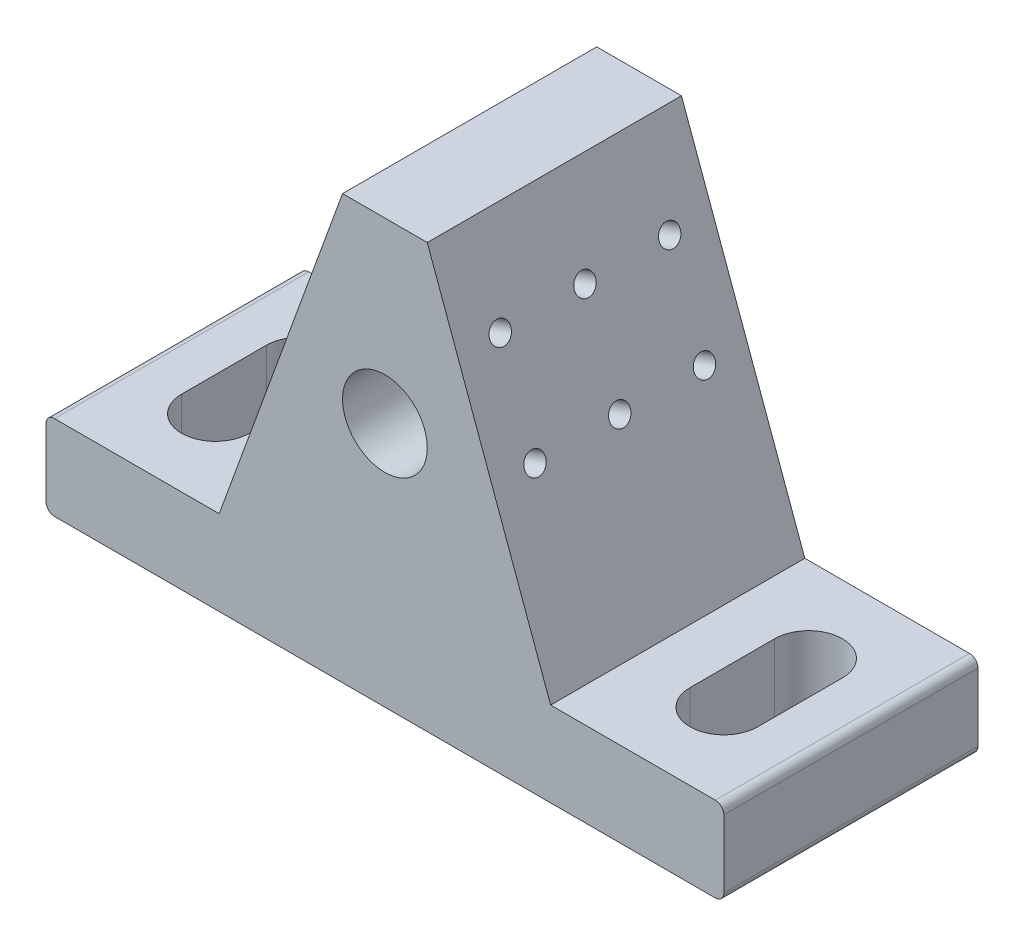
ISO-10303-21;
HEADER;
FILE_DESCRIPTION(('STEP AP214'),'2;1');
FILE_NAME('part.step','',(''),(''),'','','');
FILE_SCHEMA(('AUTOMOTIVE_DESIGN { 1 0 10303 214 1 1 1 1 }'));
ENDSEC;
DATA;
#1=APPLICATION_CONTEXT('core data for automotive mechanical design processes');
#2=APPLICATION_PROTOCOL_DEFINITION('international standard','automotive_design',2000,#1);
#3=PRODUCT_CONTEXT('',#1,'mechanical');
#4=PRODUCT('Part','Part','',(#3));
#5=PRODUCT_RELATED_PRODUCT_CATEGORY('part','',(#4));
#6=PRODUCT_DEFINITION_FORMATION('','',#4);
#7=PRODUCT_DEFINITION_CONTEXT('part definition',#1,'design');
#8=PRODUCT_DEFINITION('design','',#6,#7);
#9=PRODUCT_DEFINITION_SHAPE('','',#8);
#10=(LENGTH_UNIT() NAMED_UNIT(*) SI_UNIT(.MILLI.,.METRE.));
#11=(NAMED_UNIT(*) PLANE_ANGLE_UNIT() SI_UNIT($,.RADIAN.));
#12=(NAMED_UNIT(*) SI_UNIT($,.STERADIAN.) SOLID_ANGLE_UNIT());
#13=UNCERTAINTY_MEASURE_WITH_UNIT(LENGTH_MEASURE(1.E-05),#10,'distance_accuracy_value','');
#14=(GEOMETRIC_REPRESENTATION_CONTEXT(3) GLOBAL_UNCERTAINTY_ASSIGNED_CONTEXT((#13)) GLOBAL_UNIT_ASSIGNED_CONTEXT((#10,
#11,#12)) REPRESENTATION_CONTEXT('',''));
#15=CARTESIAN_POINT('',(0.,0.,0.));
#16=DIRECTION('',(0.,0.,1.));
#17=DIRECTION('',(1.,0.,0.));
#18=AXIS2_PLACEMENT_3D('',#15,#16,#17);
#19=CARTESIAN_POINT('',(19.558809370648,10.,15.));
#20=DIRECTION('',(-0.939692620785909,-0.342020143325666,0.));
#21=DIRECTION('',(0.342020143325666,-0.939692620785909,0.));
#22=AXIS2_PLACEMENT_3D('',#19,#20,#21);
#23=PLANE('',#22);
#24=CARTESIAN_POINT('',(8.61416478422666,40.0701638651491,-10.));
#25=DIRECTION('',(0.939692620785909,0.342020143325666,0.));
#26=DIRECTION('',(-0.342020143325666,0.939692620785909,0.));
#27=AXIS2_PLACEMENT_3D('',#24,#25,#26);
#28=CIRCLE('',#27,1.24999999999999);
#29=CARTESIAN_POINT('',(8.18663960506958,41.2447796411315,-10.));
#30=VERTEX_POINT('',#29);
#31=EDGE_CURVE('E230',#30,#30,#28,.T.);
#32=ORIENTED_EDGE('',*,*,#31,.F.);
#33=EDGE_LOOP('',(#32));
#34=FACE_BOUND('',#33,.T.);
#35=CARTESIAN_POINT('',(12.7184065041347,28.7938524157182,-10.));
#36=DIRECTION('',(0.939692620785909,0.342020143325666,0.));
#37=DIRECTION('',(-0.342020143325666,0.939692620785909,0.));
#38=AXIS2_PLACEMENT_3D('',#35,#36,#37);
#39=CIRCLE('',#38,1.24999999999999);
#40=CARTESIAN_POINT('',(12.2908813249776,29.9684681917006,-10.));
#41=VERTEX_POINT('',#40);
#42=EDGE_CURVE('E229',#41,#41,#39,.T.);
#43=ORIENTED_EDGE('',*,*,#42,.F.);
#44=EDGE_LOOP('',(#43));
#45=FACE_BOUND('',#44,.T.);
#46=CARTESIAN_POINT('',(8.61416478422666,40.0701638651491,0.));
#47=DIRECTION('',(0.939692620785909,0.342020143325666,0.));
#48=DIRECTION('',(-0.342020143325666,0.939692620785909,0.));
#49=AXIS2_PLACEMENT_3D('',#46,#47,#48);
#50=CIRCLE('',#49,1.24999999999999);
#51=CARTESIAN_POINT('',(8.18663960506958,41.2447796411315,0.));
#52=VERTEX_POINT('',#51);
#53=EDGE_CURVE('E245',#52,#52,#50,.T.);
#54=ORIENTED_EDGE('',*,*,#53,.F.);
#55=EDGE_LOOP('',(#54));
#56=FACE_BOUND('',#55,.T.);
#57=CARTESIAN_POINT('',(12.7184065041347,28.7938524157182,0.));
#58=DIRECTION('',(0.939692620785909,0.342020143325666,0.));
#59=DIRECTION('',(-0.342020143325666,0.939692620785909,0.));
#60=AXIS2_PLACEMENT_3D('',#57,#58,#59);
#61=CIRCLE('',#60,1.24999999999999);
#62=CARTESIAN_POINT('',(12.2908813249776,29.9684681917006,0.));
#63=VERTEX_POINT('',#62);
#64=EDGE_CURVE('E253',#63,#63,#61,.T.);
#65=ORIENTED_EDGE('',*,*,#64,.F.);
#66=EDGE_LOOP('',(#65));
#67=FACE_BOUND('',#66,.T.);
#68=CARTESIAN_POINT('',(8.61416478422666,40.0701638651491,10.));
#69=DIRECTION('',(0.939692620785909,0.342020143325666,0.));
#70=DIRECTION('',(-0.342020143325666,0.939692620785909,0.));
#71=AXIS2_PLACEMENT_3D('',#68,#69,#70);
#72=CIRCLE('',#71,1.24999999999999);
#73=CARTESIAN_POINT('',(8.18663960506958,41.2447796411315,10.));
#74=VERTEX_POINT('',#73);
#75=EDGE_CURVE('E261',#74,#74,#72,.T.);
#76=ORIENTED_EDGE('',*,*,#75,.F.);
#77=EDGE_LOOP('',(#76));
#78=FACE_BOUND('',#77,.T.);
#79=DIRECTION('',(-0.342020143325666,0.939692620785909,0.));
#80=VECTOR('',#79,1.);
#81=CARTESIAN_POINT('',(19.558809370648,10.,-15.));
#82=LINE('',#81,#80);
#83=CARTESIAN_POINT('',(19.558809370648,10.,-15.));
#84=VERTEX_POINT('',#83);
#85=CARTESIAN_POINT('',(5.,50.,-15.));
#86=VERTEX_POINT('',#85);
#87=EDGE_CURVE('E390',#84,#86,#82,.T.);
#88=ORIENTED_EDGE('',*,*,#87,.T.);
#89=DIRECTION('',(0.,0.,-1.));
#90=VECTOR('',#89,1.);
#91=CARTESIAN_POINT('',(5.,50.,15.));
#92=LINE('',#91,#90);
#93=CARTESIAN_POINT('',(5.,50.,15.));
#94=VERTEX_POINT('',#93);
#95=EDGE_CURVE('E416',#94,#86,#92,.T.);
#96=ORIENTED_EDGE('',*,*,#95,.F.);
#97=DIRECTION('',(-0.342020143325666,0.939692620785909,0.));
#98=VECTOR('',#97,1.);
#99=CARTESIAN_POINT('',(19.558809370648,10.,15.));
#100=LINE('',#99,#98);
#101=CARTESIAN_POINT('',(19.558809370648,10.,15.));
#102=VERTEX_POINT('',#101);
#103=EDGE_CURVE('E363',#102,#94,#100,.T.);
#104=ORIENTED_EDGE('',*,*,#103,.F.);
#105=DIRECTION('',(0.,0.,-1.));
#106=VECTOR('',#105,1.);
#107=CARTESIAN_POINT('',(19.558809370648,10.,15.));
#108=LINE('',#107,#106);
#109=EDGE_CURVE('E420',#102,#84,#108,.T.);
#110=ORIENTED_EDGE('',*,*,#109,.T.);
#111=EDGE_LOOP('',(#88,#96,#104,#110));
#112=FACE_BOUND('',#111,.T.);
#113=CARTESIAN_POINT('',(12.7184065041347,28.7938524157182,10.));
#114=DIRECTION('',(0.939692620785909,0.342020143325666,0.));
#115=DIRECTION('',(-0.342020143325666,0.939692620785909,0.));
#116=AXIS2_PLACEMENT_3D('',#113,#114,#115);
#117=CIRCLE('',#116,1.24999999999999);
#118=CARTESIAN_POINT('',(12.2908813249776,29.9684681917006,10.));
#119=VERTEX_POINT('',#118);
#120=EDGE_CURVE('E269',#119,#119,#117,.T.);
#121=ORIENTED_EDGE('',*,*,#120,.F.);
#122=EDGE_LOOP('',(#121));
#123=FACE_BOUND('',#122,.T.);
#124=ADVANCED_FACE('F62',(#34,#45,#56,#67,#78,#112,#123),#23,.F.);
#125=CARTESIAN_POINT('',(40.,10.,15.));
#126=DIRECTION('',(0.,-1.,0.));
#127=DIRECTION('',(1.,0.,0.));
#128=AXIS2_PLACEMENT_3D('',#125,#126,#127);
#129=PLANE('',#128);
#130=DIRECTION('',(-1.,0.,0.));
#131=VECTOR('',#130,1.);
#132=CARTESIAN_POINT('',(40.,10.,15.));
#133=LINE('',#132,#131);
#134=CARTESIAN_POINT('',(39.,10.,15.));
#135=VERTEX_POINT('',#134);
#136=EDGE_CURVE('E359',#135,#102,#133,.T.);
#137=ORIENTED_EDGE('',*,*,#136,.F.);
#138=DIRECTION('',(0.,0.,-1.));
#139=VECTOR('',#138,1.);
#140=CARTESIAN_POINT('',(39.,10.,15.));
#141=LINE('',#140,#139);
#142=CARTESIAN_POINT('',(39.,10.,-15.));
#143=VERTEX_POINT('',#142);
#144=EDGE_CURVE('E14',#135,#143,#141,.T.);
#145=ORIENTED_EDGE('',*,*,#144,.T.);
#146=DIRECTION('',(-1.,0.,0.));
#147=VECTOR('',#146,1.);
#148=CARTESIAN_POINT('',(40.,10.,-15.));
#149=LINE('',#148,#147);
#150=EDGE_CURVE('E387',#143,#84,#149,.T.);
#151=ORIENTED_EDGE('',*,*,#150,.T.);
#152=ORIENTED_EDGE('',*,*,#109,.F.);
#153=EDGE_LOOP('',(#137,#145,#151,#152));
#154=FACE_BOUND('',#153,.T.);
#155=CARTESIAN_POINT('',(30.,10.,5.));
#156=DIRECTION('',(0.,-1.,0.));
#157=DIRECTION('',(1.,0.,0.));
#158=AXIS2_PLACEMENT_3D('',#155,#156,#157);
#159=CIRCLE('',#158,4.);
#160=CARTESIAN_POINT('',(26.,9.99999999999999,5.));
#161=VERTEX_POINT('',#160);
#162=CARTESIAN_POINT('',(34.,10.,5.));
#163=VERTEX_POINT('',#162);
#164=EDGE_CURVE('E352',#161,#163,#159,.F.);
#165=ORIENTED_EDGE('',*,*,#164,.F.);
#166=DIRECTION('',(0.,0.,1.));
#167=VECTOR('',#166,1.);
#168=CARTESIAN_POINT('',(26.,10.,15.));
#169=LINE('',#168,#167);
#170=CARTESIAN_POINT('',(26.,10.,-5.));
#171=VERTEX_POINT('',#170);
#172=EDGE_CURVE('E342',#171,#161,#169,.T.);
#173=ORIENTED_EDGE('',*,*,#172,.F.);
#174=CARTESIAN_POINT('',(30.,10.,-5.));
#175=DIRECTION('',(0.,-1.,0.));
#176=DIRECTION('',(1.,0.,0.));
#177=AXIS2_PLACEMENT_3D('',#174,#175,#176);
#178=CIRCLE('',#177,4.);
#179=CARTESIAN_POINT('',(34.,10.,-5.));
#180=VERTEX_POINT('',#179);
#181=EDGE_CURVE('E345',#180,#171,#178,.F.);
#182=ORIENTED_EDGE('',*,*,#181,.F.);
#183=DIRECTION('',(0.,0.,-1.));
#184=VECTOR('',#183,1.);
#185=CARTESIAN_POINT('',(34.,10.,15.));
#186=LINE('',#185,#184);
#187=EDGE_CURVE('E349',#163,#180,#186,.T.);
#188=ORIENTED_EDGE('',*,*,#187,.F.);
#189=EDGE_LOOP('',(#165,#173,#182,#188));
#190=FACE_BOUND('',#189,.T.);
#191=ADVANCED_FACE('F646',(#154,#190),#129,.F.);
#192=CARTESIAN_POINT('',(-40.,0.,15.));
#193=DIRECTION('',(0.,1.,0.));
#194=DIRECTION('',(0.,0.,1.));
#195=AXIS2_PLACEMENT_3D('',#192,#193,#194);
#196=PLANE('',#195);
#197=DIRECTION('',(0.,0.,-1.));
#198=VECTOR('',#197,1.);
#199=CARTESIAN_POINT('',(-34.,0.,5.));
#200=LINE('',#199,#198);
#201=CARTESIAN_POINT('',(-34.,0.,5.));
#202=VERTEX_POINT('',#201);
#203=CARTESIAN_POINT('',(-34.,0.,-5.));
#204=VERTEX_POINT('',#203);
#205=EDGE_CURVE('E296',#202,#204,#200,.T.);
#206=ORIENTED_EDGE('',*,*,#205,.F.);
#207=CARTESIAN_POINT('',(-30.,0.,5.));
#208=DIRECTION('',(0.,-1.,0.));
#209=DIRECTION('',(0.,0.,1.));
#210=AXIS2_PLACEMENT_3D('',#207,#208,#209);
#211=CIRCLE('',#210,4.);
#212=CARTESIAN_POINT('',(-26.,0.,5.));
#213=VERTEX_POINT('',#212);
#214=EDGE_CURVE('E282',#213,#202,#211,.T.);
#215=ORIENTED_EDGE('',*,*,#214,.F.);
#216=DIRECTION('',(0.,0.,1.));
#217=VECTOR('',#216,1.);
#218=CARTESIAN_POINT('',(-26.,0.,5.));
#219=LINE('',#218,#217);
#220=CARTESIAN_POINT('',(-26.,0.,-5.));
#221=VERTEX_POINT('',#220);
#222=EDGE_CURVE('E288',#221,#213,#219,.T.);
#223=ORIENTED_EDGE('',*,*,#222,.F.);
#224=CARTESIAN_POINT('',(-30.,0.,-5.));
#225=DIRECTION('',(0.,-1.,0.));
#226=DIRECTION('',(0.,0.,1.));
#227=AXIS2_PLACEMENT_3D('',#224,#225,#226);
#228=CIRCLE('',#227,4.);
#229=EDGE_CURVE('E292',#204,#221,#228,.T.);
#230=ORIENTED_EDGE('',*,*,#229,.F.);
#231=EDGE_LOOP('',(#206,#215,#223,#230));
#232=FACE_BOUND('',#231,.T.);
#233=DIRECTION('',(1.,0.,0.));
#234=VECTOR('',#233,1.);
#235=CARTESIAN_POINT('',(-40.,0.,15.));
#236=LINE('',#235,#234);
#237=CARTESIAN_POINT('',(-39.,0.,15.));
#238=VERTEX_POINT('',#237);
#239=CARTESIAN_POINT('',(39.,0.,15.));
#240=VERTEX_POINT('',#239);
#241=EDGE_CURVE('E379',#238,#240,#236,.T.);
#242=ORIENTED_EDGE('',*,*,#241,.F.);
#243=DIRECTION('',(0.,0.,-1.));
#244=VECTOR('',#243,1.);
#245=CARTESIAN_POINT('',(-39.,0.,15.));
#246=LINE('',#245,#244);
#247=CARTESIAN_POINT('',(-39.,0.,-15.));
#248=VERTEX_POINT('',#247);
#249=EDGE_CURVE('E443',#238,#248,#246,.T.);
#250=ORIENTED_EDGE('',*,*,#249,.T.);
#251=DIRECTION('',(1.,0.,0.));
#252=VECTOR('',#251,1.);
#253=CARTESIAN_POINT('',(-40.,0.,-15.));
#254=LINE('',#253,#252);
#255=CARTESIAN_POINT('',(39.,0.,-15.));
#256=VERTEX_POINT('',#255);
#257=EDGE_CURVE('E360',#248,#256,#254,.T.);
#258=ORIENTED_EDGE('',*,*,#257,.T.);
#259=DIRECTION('',(0.,0.,-1.));
#260=VECTOR('',#259,1.);
#261=CARTESIAN_POINT('',(39.,0.,15.));
#262=LINE('',#261,#260);
#263=EDGE_CURVE('E440',#256,#240,#262,.F.);
#264=ORIENTED_EDGE('',*,*,#263,.T.);
#265=EDGE_LOOP('',(#242,#250,#258,#264));
#266=FACE_BOUND('',#265,.T.);
#267=CARTESIAN_POINT('',(30.,0.,5.));
#268=DIRECTION('',(0.,1.,0.));
#269=DIRECTION('',(0.,0.,1.));
#270=AXIS2_PLACEMENT_3D('',#267,#268,#269);
#271=CIRCLE('',#270,4.);
#272=CARTESIAN_POINT('',(26.,0.,5.));
#273=VERTEX_POINT('',#272);
#274=CARTESIAN_POINT('',(34.,0.,5.));
#275=VERTEX_POINT('',#274);
#276=EDGE_CURVE('E313',#273,#275,#271,.T.);
#277=ORIENTED_EDGE('',*,*,#276,.T.);
#278=DIRECTION('',(0.,0.,-1.));
#279=VECTOR('',#278,1.);
#280=CARTESIAN_POINT('',(34.,0.,5.));
#281=LINE('',#280,#279);
#282=CARTESIAN_POINT('',(34.,0.,-5.));
#283=VERTEX_POINT('',#282);
#284=EDGE_CURVE('E317',#275,#283,#281,.T.);
#285=ORIENTED_EDGE('',*,*,#284,.T.);
#286=CARTESIAN_POINT('',(30.,0.,-5.));
#287=DIRECTION('',(0.,1.,0.));
#288=DIRECTION('',(0.,0.,1.));
#289=AXIS2_PLACEMENT_3D('',#286,#287,#288);
#290=CIRCLE('',#289,4.);
#291=CARTESIAN_POINT('',(26.,0.,-5.));
#292=VERTEX_POINT('',#291);
#293=EDGE_CURVE('E321',#283,#292,#290,.T.);
#294=ORIENTED_EDGE('',*,*,#293,.T.);
#295=DIRECTION('',(0.,0.,1.));
#296=VECTOR('',#295,1.);
#297=CARTESIAN_POINT('',(26.,0.,5.));
#298=LINE('',#297,#296);
#299=EDGE_CURVE('E325',#292,#273,#298,.T.);
#300=ORIENTED_EDGE('',*,*,#299,.T.);
#301=EDGE_LOOP('',(#277,#285,#294,#300));
#302=FACE_BOUND('',#301,.T.);
#303=ADVANCED_FACE('F680',(#232,#266,#302),#196,.F.);
#304=CARTESIAN_POINT('',(40.,0.,15.));
#305=DIRECTION('',(-1.,0.,0.));
#306=DIRECTION('',(0.,0.,1.));
#307=AXIS2_PLACEMENT_3D('',#304,#305,#306);
#308=PLANE('',#307);
#309=DIRECTION('',(0.,1.,0.));
#310=VECTOR('',#309,1.);
#311=CARTESIAN_POINT('',(40.,0.,15.));
#312=LINE('',#311,#310);
#313=CARTESIAN_POINT('',(40.,1.,15.));
#314=VERTEX_POINT('',#313);
#315=CARTESIAN_POINT('',(40.,9.,15.));
#316=VERTEX_POINT('',#315);
#317=EDGE_CURVE('E356',#314,#316,#312,.T.);
#318=ORIENTED_EDGE('',*,*,#317,.F.);
#319=DIRECTION('',(0.,0.,-1.));
#320=VECTOR('',#319,1.);
#321=CARTESIAN_POINT('',(40.,1.,15.));
#322=LINE('',#321,#320);
#323=CARTESIAN_POINT('',(40.,1.,-15.));
#324=VERTEX_POINT('',#323);
#325=EDGE_CURVE('E480',#314,#324,#322,.T.);
#326=ORIENTED_EDGE('',*,*,#325,.T.);
#327=DIRECTION('',(0.,1.,0.));
#328=VECTOR('',#327,1.);
#329=CARTESIAN_POINT('',(40.,0.,-15.));
#330=LINE('',#329,#328);
#331=CARTESIAN_POINT('',(40.,9.,-15.));
#332=VERTEX_POINT('',#331);
#333=EDGE_CURVE('E355',#324,#332,#330,.T.);
#334=ORIENTED_EDGE('',*,*,#333,.T.);
#335=DIRECTION('',(0.,0.,-1.));
#336=VECTOR('',#335,1.);
#337=CARTESIAN_POINT('',(40.,9.,15.));
#338=LINE('',#337,#336);
#339=EDGE_CURVE('E477',#332,#316,#338,.F.);
#340=ORIENTED_EDGE('',*,*,#339,.T.);
#341=EDGE_LOOP('',(#318,#326,#334,#340));
#342=FACE_BOUND('',#341,.T.);
#343=ADVANCED_FACE('F634',(#342),#308,.F.);
#344=CARTESIAN_POINT('',(5.,50.,15.));
#345=DIRECTION('',(0.,-1.,0.));
#346=DIRECTION('',(0.,0.,-1.));
#347=AXIS2_PLACEMENT_3D('',#344,#345,#346);
#348=PLANE('',#347);
#349=DIRECTION('',(-1.,0.,0.));
#350=VECTOR('',#349,1.);
#351=CARTESIAN_POINT('',(5.,50.,-15.));
#352=LINE('',#351,#350);
#353=CARTESIAN_POINT('',(-5.,50.,-15.));
#354=VERTEX_POINT('',#353);
#355=EDGE_CURVE('E393',#86,#354,#352,.T.);
#356=ORIENTED_EDGE('',*,*,#355,.T.);
#357=DIRECTION('',(0.,0.,-1.));
#358=VECTOR('',#357,1.);
#359=CARTESIAN_POINT('',(-5.,50.,15.));
#360=LINE('',#359,#358);
#361=CARTESIAN_POINT('',(-5.,50.,15.));
#362=VERTEX_POINT('',#361);
#363=EDGE_CURVE('E412',#362,#354,#360,.T.);
#364=ORIENTED_EDGE('',*,*,#363,.F.);
#365=DIRECTION('',(-1.,0.,0.));
#366=VECTOR('',#365,1.);
#367=CARTESIAN_POINT('',(5.,50.,15.));
#368=LINE('',#367,#366);
#369=EDGE_CURVE('E366',#94,#362,#368,.T.);
#370=ORIENTED_EDGE('',*,*,#369,.F.);
#371=ORIENTED_EDGE('',*,*,#95,.T.);
#372=EDGE_LOOP('',(#356,#364,#370,#371));
#373=FACE_BOUND('',#372,.T.);
#374=ADVANCED_FACE('F658',(#373),#348,.F.);
#375=CARTESIAN_POINT('',(-19.558809370648,10.,15.));
#376=DIRECTION('',(0.939692620785909,-0.342020143325666,0.));
#377=DIRECTION('',(0.342020143325666,0.939692620785909,0.));
#378=AXIS2_PLACEMENT_3D('',#375,#376,#377);
#379=PLANE('',#378);
#380=DIRECTION('',(-0.342020143325666,-0.939692620785909,0.));
#381=VECTOR('',#380,1.);
#382=CARTESIAN_POINT('',(-19.558809370648,10.,-15.));
#383=LINE('',#382,#381);
#384=CARTESIAN_POINT('',(-19.558809370648,10.,-15.));
#385=VERTEX_POINT('',#384);
#386=EDGE_CURVE('E396',#354,#385,#383,.T.);
#387=ORIENTED_EDGE('',*,*,#386,.T.);
#388=DIRECTION('',(0.,0.,-1.));
#389=VECTOR('',#388,1.);
#390=CARTESIAN_POINT('',(-19.558809370648,10.,15.));
#391=LINE('',#390,#389);
#392=CARTESIAN_POINT('',(-19.558809370648,10.,15.));
#393=VERTEX_POINT('',#392);
#394=EDGE_CURVE('E383',#393,#385,#391,.T.);
#395=ORIENTED_EDGE('',*,*,#394,.F.);
#396=DIRECTION('',(-0.342020143325666,-0.939692620785909,0.));
#397=VECTOR('',#396,1.);
#398=CARTESIAN_POINT('',(-19.558809370648,10.,15.));
#399=LINE('',#398,#397);
#400=EDGE_CURVE('E369',#362,#393,#399,.T.);
#401=ORIENTED_EDGE('',*,*,#400,.F.);
#402=ORIENTED_EDGE('',*,*,#363,.T.);
#403=EDGE_LOOP('',(#387,#395,#401,#402));
#404=FACE_BOUND('',#403,.T.);
#405=ADVANCED_FACE('F663',(#404),#379,.F.);
#406=CARTESIAN_POINT('',(-40.,10.,15.));
#407=DIRECTION('',(0.,-1.,0.));
#408=DIRECTION('',(1.,0.,0.));
#409=AXIS2_PLACEMENT_3D('',#406,#407,#408);
#410=PLANE('',#409);
#411=DIRECTION('',(0.,0.,1.));
#412=VECTOR('',#411,1.);
#413=CARTESIAN_POINT('',(-26.,10.,15.));
#414=LINE('',#413,#412);
#415=CARTESIAN_POINT('',(-26.,10.,-5.));
#416=VERTEX_POINT('',#415);
#417=CARTESIAN_POINT('',(-26.,9.99999999999999,5.));
#418=VERTEX_POINT('',#417);
#419=EDGE_CURVE('E432',#416,#418,#414,.T.);
#420=ORIENTED_EDGE('',*,*,#419,.T.);
#421=CARTESIAN_POINT('',(-30.,10.,5.));
#422=DIRECTION('',(0.,-1.,0.));
#423=DIRECTION('',(1.,0.,0.));
#424=AXIS2_PLACEMENT_3D('',#421,#422,#423);
#425=CIRCLE('',#424,4.);
#426=CARTESIAN_POINT('',(-34.,10.,5.));
#427=VERTEX_POINT('',#426);
#428=EDGE_CURVE('E436',#418,#427,#425,.T.);
#429=ORIENTED_EDGE('',*,*,#428,.T.);
#430=DIRECTION('',(0.,0.,-1.));
#431=VECTOR('',#430,1.);
#432=CARTESIAN_POINT('',(-34.,10.,15.));
#433=LINE('',#432,#431);
#434=CARTESIAN_POINT('',(-34.,10.,-5.));
#435=VERTEX_POINT('',#434);
#436=EDGE_CURVE('E424',#427,#435,#433,.T.);
#437=ORIENTED_EDGE('',*,*,#436,.T.);
#438=CARTESIAN_POINT('',(-30.,10.,-5.));
#439=DIRECTION('',(0.,-1.,0.));
#440=DIRECTION('',(1.,0.,0.));
#441=AXIS2_PLACEMENT_3D('',#438,#439,#440);
#442=CIRCLE('',#441,4.);
#443=EDGE_CURVE('E428',#435,#416,#442,.T.);
#444=ORIENTED_EDGE('',*,*,#443,.T.);
#445=EDGE_LOOP('',(#420,#429,#437,#444));
#446=FACE_BOUND('',#445,.T.);
#447=DIRECTION('',(-1.,0.,0.));
#448=VECTOR('',#447,1.);
#449=CARTESIAN_POINT('',(-40.,10.,-15.));
#450=LINE('',#449,#448);
#451=CARTESIAN_POINT('',(-39.,10.,-15.));
#452=VERTEX_POINT('',#451);
#453=EDGE_CURVE('E399',#385,#452,#450,.T.);
#454=ORIENTED_EDGE('',*,*,#453,.T.);
#455=DIRECTION('',(0.,0.,-1.));
#456=VECTOR('',#455,1.);
#457=CARTESIAN_POINT('',(-39.,10.,15.));
#458=LINE('',#457,#456);
#459=CARTESIAN_POINT('',(-39.,10.,15.));
#460=VERTEX_POINT('',#459);
#461=EDGE_CURVE('E71',#452,#460,#458,.F.);
#462=ORIENTED_EDGE('',*,*,#461,.T.);
#463=DIRECTION('',(-1.,0.,0.));
#464=VECTOR('',#463,1.);
#465=CARTESIAN_POINT('',(-40.,10.,15.));
#466=LINE('',#465,#464);
#467=EDGE_CURVE('E372',#393,#460,#466,.T.);
#468=ORIENTED_EDGE('',*,*,#467,.F.);
#469=ORIENTED_EDGE('',*,*,#394,.T.);
#470=EDGE_LOOP('',(#454,#462,#468,#469));
#471=FACE_BOUND('',#470,.T.);
#472=ADVANCED_FACE('F718',(#446,#471),#410,.F.);
#473=CARTESIAN_POINT('',(-40.,0.,15.));
#474=DIRECTION('',(1.,0.,0.));
#475=DIRECTION('',(0.,0.,-1.));
#476=AXIS2_PLACEMENT_3D('',#473,#474,#475);
#477=PLANE('',#476);
#478=DIRECTION('',(0.,-1.,0.));
#479=VECTOR('',#478,1.);
#480=CARTESIAN_POINT('',(-40.,0.,-15.));
#481=LINE('',#480,#479);
#482=CARTESIAN_POINT('',(-40.,9.,-15.));
#483=VERTEX_POINT('',#482);
#484=CARTESIAN_POINT('',(-40.,1.,-15.));
#485=VERTEX_POINT('',#484);
#486=EDGE_CURVE('E402',#483,#485,#481,.T.);
#487=ORIENTED_EDGE('',*,*,#486,.T.);
#488=DIRECTION('',(0.,0.,-1.));
#489=VECTOR('',#488,1.);
#490=CARTESIAN_POINT('',(-40.,1.,15.));
#491=LINE('',#490,#489);
#492=CARTESIAN_POINT('',(-40.,1.,15.));
#493=VERTEX_POINT('',#492);
#494=EDGE_CURVE('E463',#485,#493,#491,.F.);
#495=ORIENTED_EDGE('',*,*,#494,.T.);
#496=DIRECTION('',(0.,-1.,0.));
#497=VECTOR('',#496,1.);
#498=CARTESIAN_POINT('',(-40.,0.,15.));
#499=LINE('',#498,#497);
#500=CARTESIAN_POINT('',(-40.,9.,15.));
#501=VERTEX_POINT('',#500);
#502=EDGE_CURVE('E375',#501,#493,#499,.T.);
#503=ORIENTED_EDGE('',*,*,#502,.F.);
#504=DIRECTION('',(0.,0.,-1.));
#505=VECTOR('',#504,1.);
#506=CARTESIAN_POINT('',(-40.,9.,15.));
#507=LINE('',#506,#505);
#508=EDGE_CURVE('E459',#501,#483,#507,.T.);
#509=ORIENTED_EDGE('',*,*,#508,.T.);
#510=EDGE_LOOP('',(#487,#495,#503,#509));
#511=FACE_BOUND('',#510,.T.);
#512=ADVANCED_FACE('F671',(#511),#477,.F.);
#513=CARTESIAN_POINT('',(0.,0.,15.));
#514=DIRECTION('',(0.,0.,1.));
#515=DIRECTION('',(1.,0.,0.));
#516=AXIS2_PLACEMENT_3D('',#513,#514,#515);
#517=PLANE('',#516);
#518=CARTESIAN_POINT('',(0.,29.,15.));
#519=DIRECTION('',(0.,0.,1.));
#520=DIRECTION('',(1.,0.,0.));
#521=AXIS2_PLACEMENT_3D('',#518,#519,#520);
#522=CIRCLE('',#521,5.);
#523=CARTESIAN_POINT('',(5.,29.,15.));
#524=VERTEX_POINT('',#523);
#525=EDGE_CURVE('E277',#524,#524,#522,.T.);
#526=ORIENTED_EDGE('',*,*,#525,.F.);
#527=EDGE_LOOP('',(#526));
#528=FACE_BOUND('',#527,.T.);
#529=ORIENTED_EDGE('',*,*,#502,.T.);
#530=CARTESIAN_POINT('',(-39.,1.,15.));
#531=DIRECTION('',(0.,0.,1.));
#532=DIRECTION('',(1.,0.,0.));
#533=AXIS2_PLACEMENT_3D('',#530,#531,#532);
#534=CIRCLE('',#533,1.);
#535=EDGE_CURVE('E474',#493,#238,#534,.T.);
#536=ORIENTED_EDGE('',*,*,#535,.T.);
#537=ORIENTED_EDGE('',*,*,#241,.T.);
#538=CARTESIAN_POINT('',(39.,1.,15.));
#539=DIRECTION('',(0.,0.,1.));
#540=DIRECTION('',(1.,0.,0.));
#541=AXIS2_PLACEMENT_3D('',#538,#539,#540);
#542=CIRCLE('',#541,1.);
#543=EDGE_CURVE('E471',#240,#314,#542,.T.);
#544=ORIENTED_EDGE('',*,*,#543,.T.);
#545=ORIENTED_EDGE('',*,*,#317,.T.);
#546=CARTESIAN_POINT('',(39.,9.,15.));
#547=DIRECTION('',(0.,0.,1.));
#548=DIRECTION('',(1.,0.,0.));
#549=AXIS2_PLACEMENT_3D('',#546,#547,#548);
#550=CIRCLE('',#549,1.);
#551=EDGE_CURVE('E85',#316,#135,#550,.T.);
#552=ORIENTED_EDGE('',*,*,#551,.T.);
#553=ORIENTED_EDGE('',*,*,#136,.T.);
#554=ORIENTED_EDGE('',*,*,#103,.T.);
#555=ORIENTED_EDGE('',*,*,#369,.T.);
#556=ORIENTED_EDGE('',*,*,#400,.T.);
#557=ORIENTED_EDGE('',*,*,#467,.T.);
#558=CARTESIAN_POINT('',(-39.,9.,15.));
#559=DIRECTION('',(0.,0.,1.));
#560=DIRECTION('',(1.,0.,0.));
#561=AXIS2_PLACEMENT_3D('',#558,#559,#560);
#562=CIRCLE('',#561,1.);
#563=EDGE_CURVE('E468',#460,#501,#562,.T.);
#564=ORIENTED_EDGE('',*,*,#563,.T.);
#565=EDGE_LOOP('',(#529,#536,#537,#544,#545,#552,#553,#554,#555,#556,#557,#564));
#566=FACE_BOUND('',#565,.T.);
#567=ADVANCED_FACE('F650',(#528,#566),#517,.T.);
#568=CARTESIAN_POINT('',(0.,0.,-15.));
#569=DIRECTION('',(0.,0.,1.));
#570=DIRECTION('',(1.,0.,0.));
#571=AXIS2_PLACEMENT_3D('',#568,#569,#570);
#572=PLANE('',#571);
#573=CARTESIAN_POINT('',(0.,29.,-15.));
#574=DIRECTION('',(0.,0.,1.));
#575=DIRECTION('',(1.,0.,0.));
#576=AXIS2_PLACEMENT_3D('',#573,#574,#575);
#577=CIRCLE('',#576,5.);
#578=CARTESIAN_POINT('',(5.,29.,-15.));
#579=VERTEX_POINT('',#578);
#580=EDGE_CURVE('E278',#579,#579,#577,.T.);
#581=ORIENTED_EDGE('',*,*,#580,.T.);
#582=EDGE_LOOP('',(#581));
#583=FACE_BOUND('',#582,.T.);
#584=ORIENTED_EDGE('',*,*,#257,.F.);
#585=CARTESIAN_POINT('',(-39.,1.,-15.));
#586=DIRECTION('',(0.,0.,1.));
#587=DIRECTION('',(1.,0.,0.));
#588=AXIS2_PLACEMENT_3D('',#585,#586,#587);
#589=CIRCLE('',#588,1.);
#590=EDGE_CURVE('E456',#248,#485,#589,.F.);
#591=ORIENTED_EDGE('',*,*,#590,.T.);
#592=ORIENTED_EDGE('',*,*,#486,.F.);
#593=CARTESIAN_POINT('',(-39.,9.,-15.));
#594=DIRECTION('',(0.,0.,1.));
#595=DIRECTION('',(1.,0.,0.));
#596=AXIS2_PLACEMENT_3D('',#593,#594,#595);
#597=CIRCLE('',#596,1.);
#598=EDGE_CURVE('E450',#483,#452,#597,.F.);
#599=ORIENTED_EDGE('',*,*,#598,.T.);
#600=ORIENTED_EDGE('',*,*,#453,.F.);
#601=ORIENTED_EDGE('',*,*,#386,.F.);
#602=ORIENTED_EDGE('',*,*,#355,.F.);
#603=ORIENTED_EDGE('',*,*,#87,.F.);
#604=ORIENTED_EDGE('',*,*,#150,.F.);
#605=CARTESIAN_POINT('',(39.,9.,-15.));
#606=DIRECTION('',(0.,0.,1.));
#607=DIRECTION('',(1.,0.,0.));
#608=AXIS2_PLACEMENT_3D('',#605,#606,#607);
#609=CIRCLE('',#608,1.);
#610=EDGE_CURVE('E447',#143,#332,#609,.F.);
#611=ORIENTED_EDGE('',*,*,#610,.T.);
#612=ORIENTED_EDGE('',*,*,#333,.F.);
#613=CARTESIAN_POINT('',(39.,1.,-15.));
#614=DIRECTION('',(0.,0.,1.));
#615=DIRECTION('',(1.,0.,0.));
#616=AXIS2_PLACEMENT_3D('',#613,#614,#615);
#617=CIRCLE('',#616,1.);
#618=EDGE_CURVE('E453',#324,#256,#617,.F.);
#619=ORIENTED_EDGE('',*,*,#618,.T.);
#620=EDGE_LOOP('',(#584,#591,#592,#599,#600,#601,#602,#603,#604,#611,#612,#619));
#621=FACE_BOUND('',#620,.T.);
#622=ADVANCED_FACE('F640',(#583,#621),#572,.F.);
#623=CARTESIAN_POINT('',(30.,50.,5.));
#624=DIRECTION('',(0.,-1.,0.));
#625=DIRECTION('',(0.,0.,-1.));
#626=AXIS2_PLACEMENT_3D('',#623,#624,#625);
#627=CYLINDRICAL_SURFACE('',#626,4.);
#628=ORIENTED_EDGE('',*,*,#164,.T.);
#629=DIRECTION('',(0.,-1.,0.));
#630=VECTOR('',#629,1.);
#631=CARTESIAN_POINT('',(34.,50.,5.));
#632=LINE('',#631,#630);
#633=EDGE_CURVE('E339',#163,#275,#632,.T.);
#634=ORIENTED_EDGE('',*,*,#633,.T.);
#635=ORIENTED_EDGE('',*,*,#276,.F.);
#636=DIRECTION('',(0.,-1.,0.));
#637=VECTOR('',#636,1.);
#638=CARTESIAN_POINT('',(26.,50.,5.));
#639=LINE('',#638,#637);
#640=EDGE_CURVE('E329',#161,#273,#639,.T.);
#641=ORIENTED_EDGE('',*,*,#640,.F.);
#642=EDGE_LOOP('',(#628,#634,#635,#641));
#643=FACE_BOUND('',#642,.T.);
#644=ADVANCED_FACE('F746',(#643),#627,.F.);
#645=CARTESIAN_POINT('',(34.,50.,5.));
#646=DIRECTION('',(-1.,0.,0.));
#647=DIRECTION('',(0.,0.,1.));
#648=AXIS2_PLACEMENT_3D('',#645,#646,#647);
#649=PLANE('',#648);
#650=ORIENTED_EDGE('',*,*,#187,.T.);
#651=DIRECTION('',(0.,-1.,0.));
#652=VECTOR('',#651,1.);
#653=CARTESIAN_POINT('',(34.,50.,-5.));
#654=LINE('',#653,#652);
#655=EDGE_CURVE('E336',#180,#283,#654,.T.);
#656=ORIENTED_EDGE('',*,*,#655,.T.);
#657=ORIENTED_EDGE('',*,*,#284,.F.);
#658=ORIENTED_EDGE('',*,*,#633,.F.);
#659=EDGE_LOOP('',(#650,#656,#657,#658));
#660=FACE_BOUND('',#659,.T.);
#661=ADVANCED_FACE('F753',(#660),#649,.T.);
#662=CARTESIAN_POINT('',(30.,50.,-5.));
#663=DIRECTION('',(0.,-1.,0.));
#664=DIRECTION('',(0.,0.,-1.));
#665=AXIS2_PLACEMENT_3D('',#662,#663,#664);
#666=CYLINDRICAL_SURFACE('',#665,4.);
#667=ORIENTED_EDGE('',*,*,#181,.T.);
#668=DIRECTION('',(0.,-1.,0.));
#669=VECTOR('',#668,1.);
#670=CARTESIAN_POINT('',(26.,50.,-5.));
#671=LINE('',#670,#669);
#672=EDGE_CURVE('E333',#171,#292,#671,.T.);
#673=ORIENTED_EDGE('',*,*,#672,.T.);
#674=ORIENTED_EDGE('',*,*,#293,.F.);
#675=ORIENTED_EDGE('',*,*,#655,.F.);
#676=EDGE_LOOP('',(#667,#673,#674,#675));
#677=FACE_BOUND('',#676,.T.);
#678=ADVANCED_FACE('F761',(#677),#666,.F.);
#679=CARTESIAN_POINT('',(26.,50.,5.));
#680=DIRECTION('',(1.,0.,0.));
#681=DIRECTION('',(0.,0.,-1.));
#682=AXIS2_PLACEMENT_3D('',#679,#680,#681);
#683=PLANE('',#682);
#684=ORIENTED_EDGE('',*,*,#172,.T.);
#685=ORIENTED_EDGE('',*,*,#640,.T.);
#686=ORIENTED_EDGE('',*,*,#299,.F.);
#687=ORIENTED_EDGE('',*,*,#672,.F.);
#688=EDGE_LOOP('',(#684,#685,#686,#687));
#689=FACE_BOUND('',#688,.T.);
#690=ADVANCED_FACE('F769',(#689),#683,.T.);
#691=CARTESIAN_POINT('',(-30.,50.,5.));
#692=DIRECTION('',(0.,-1.,0.));
#693=DIRECTION('',(0.,0.,-1.));
#694=AXIS2_PLACEMENT_3D('',#691,#692,#693);
#695=CYLINDRICAL_SURFACE('',#694,4.);
#696=DIRECTION('',(0.,-1.,0.));
#697=VECTOR('',#696,1.);
#698=CARTESIAN_POINT('',(-26.,50.,5.));
#699=LINE('',#698,#697);
#700=EDGE_CURVE('E310',#418,#213,#699,.T.);
#701=ORIENTED_EDGE('',*,*,#700,.T.);
#702=ORIENTED_EDGE('',*,*,#214,.T.);
#703=DIRECTION('',(0.,-1.,0.));
#704=VECTOR('',#703,1.);
#705=CARTESIAN_POINT('',(-34.,50.,5.));
#706=LINE('',#705,#704);
#707=EDGE_CURVE('E300',#427,#202,#706,.T.);
#708=ORIENTED_EDGE('',*,*,#707,.F.);
#709=ORIENTED_EDGE('',*,*,#428,.F.);
#710=EDGE_LOOP('',(#701,#702,#708,#709));
#711=FACE_BOUND('',#710,.T.);
#712=ADVANCED_FACE('F777',(#711),#695,.F.);
#713=CARTESIAN_POINT('',(-26.,50.,5.));
#714=DIRECTION('',(1.,0.,0.));
#715=DIRECTION('',(0.,0.,-1.));
#716=AXIS2_PLACEMENT_3D('',#713,#714,#715);
#717=PLANE('',#716);
#718=DIRECTION('',(0.,-1.,0.));
#719=VECTOR('',#718,1.);
#720=CARTESIAN_POINT('',(-26.,50.,-5.));
#721=LINE('',#720,#719);
#722=EDGE_CURVE('E307',#416,#221,#721,.T.);
#723=ORIENTED_EDGE('',*,*,#722,.T.);
#724=ORIENTED_EDGE('',*,*,#222,.T.);
#725=ORIENTED_EDGE('',*,*,#700,.F.);
#726=ORIENTED_EDGE('',*,*,#419,.F.);
#727=EDGE_LOOP('',(#723,#724,#725,#726));
#728=FACE_BOUND('',#727,.T.);
#729=ADVANCED_FACE('F785',(#728),#717,.F.);
#730=CARTESIAN_POINT('',(-30.,50.,-5.));
#731=DIRECTION('',(0.,-1.,0.));
#732=DIRECTION('',(0.,0.,-1.));
#733=AXIS2_PLACEMENT_3D('',#730,#731,#732);
#734=CYLINDRICAL_SURFACE('',#733,4.);
#735=DIRECTION('',(0.,-1.,0.));
#736=VECTOR('',#735,1.);
#737=CARTESIAN_POINT('',(-34.,50.,-5.));
#738=LINE('',#737,#736);
#739=EDGE_CURVE('E304',#435,#204,#738,.T.);
#740=ORIENTED_EDGE('',*,*,#739,.T.);
#741=ORIENTED_EDGE('',*,*,#229,.T.);
#742=ORIENTED_EDGE('',*,*,#722,.F.);
#743=ORIENTED_EDGE('',*,*,#443,.F.);
#744=EDGE_LOOP('',(#740,#741,#742,#743));
#745=FACE_BOUND('',#744,.T.);
#746=ADVANCED_FACE('F793',(#745),#734,.F.);
#747=CARTESIAN_POINT('',(-34.,50.,5.));
#748=DIRECTION('',(-1.,0.,0.));
#749=DIRECTION('',(0.,0.,1.));
#750=AXIS2_PLACEMENT_3D('',#747,#748,#749);
#751=PLANE('',#750);
#752=ORIENTED_EDGE('',*,*,#707,.T.);
#753=ORIENTED_EDGE('',*,*,#205,.T.);
#754=ORIENTED_EDGE('',*,*,#739,.F.);
#755=ORIENTED_EDGE('',*,*,#436,.F.);
#756=EDGE_LOOP('',(#752,#753,#754,#755));
#757=FACE_BOUND('',#756,.T.);
#758=ADVANCED_FACE('F801',(#757),#751,.F.);
#759=CARTESIAN_POINT('',(0.,29.,-15.));
#760=DIRECTION('',(0.,0.,1.));
#761=DIRECTION('',(1.,0.,0.));
#762=AXIS2_PLACEMENT_3D('',#759,#760,#761);
#763=CYLINDRICAL_SURFACE('',#762,5.);
#764=ORIENTED_EDGE('',*,*,#580,.F.);
#765=EDGE_LOOP('',(#764));
#766=FACE_BOUND('',#765,.T.);
#767=ORIENTED_EDGE('',*,*,#525,.T.);
#768=EDGE_LOOP('',(#767));
#769=FACE_BOUND('',#768,.T.);
#770=ADVANCED_FACE('F809',(#766,#769),#763,.F.);
#771=CARTESIAN_POINT('',(5.67071184824034,26.2287013407757,10.));
#772=DIRECTION('',(0.939692620785909,0.342020143325666,0.));
#773=DIRECTION('',(-0.342020143325666,0.939692620785909,0.));
#774=AXIS2_PLACEMENT_3D('',#771,#772,#773);
#775=CONICAL_SURFACE('',#774,1.24999999999999,1.02974425867664);
#776=CARTESIAN_POINT('',(4.96493148596402,25.9718182969775,10.));
#777=VERTEX_POINT('',#776);
#778=VERTEX_LOOP('',#777);
#779=FACE_BOUND('',#778,.T.);
#780=CARTESIAN_POINT('',(5.67071184824034,26.2287013407757,10.));
#781=DIRECTION('',(0.939692620785909,0.342020143325666,0.));
#782=DIRECTION('',(-0.342020143325666,0.939692620785909,0.));
#783=AXIS2_PLACEMENT_3D('',#780,#781,#782);
#784=CIRCLE('',#783,1.24999999999999);
#785=CARTESIAN_POINT('',(5.24318666908326,27.4033171167581,10.));
#786=VERTEX_POINT('',#785);
#787=EDGE_CURVE('E273',#786,#786,#784,.T.);
#788=ORIENTED_EDGE('',*,*,#787,.T.);
#789=EDGE_LOOP('',(#788));
#790=FACE_BOUND('',#789,.T.);
#791=ADVANCED_FACE('F817',(#779,#790),#775,.F.);
#792=CARTESIAN_POINT('',(12.7184065041347,28.7938524157182,10.));
#793=DIRECTION('',(0.939692620785909,0.342020143325666,0.));
#794=DIRECTION('',(-0.342020143325666,0.939692620785909,0.));
#795=AXIS2_PLACEMENT_3D('',#792,#793,#794);
#796=CYLINDRICAL_SURFACE('',#795,1.24999999999999);
#797=ORIENTED_EDGE('',*,*,#787,.F.);
#798=EDGE_LOOP('',(#797));
#799=FACE_BOUND('',#798,.T.);
#800=ORIENTED_EDGE('',*,*,#120,.T.);
#801=EDGE_LOOP('',(#800));
#802=FACE_BOUND('',#801,.T.);
#803=ADVANCED_FACE('F825',(#799,#802),#796,.F.);
#804=CARTESIAN_POINT('',(1.56647012833235,37.5050127902066,10.));
#805=DIRECTION('',(0.939692620785909,0.342020143325666,0.));
#806=DIRECTION('',(-0.342020143325666,0.939692620785909,0.));
#807=AXIS2_PLACEMENT_3D('',#804,#805,#806);
#808=CONICAL_SURFACE('',#807,1.24999999999999,1.02974425867664);
#809=CARTESIAN_POINT('',(0.860689766056024,37.2481297464084,10.));
#810=VERTEX_POINT('',#809);
#811=VERTEX_LOOP('',#810);
#812=FACE_BOUND('',#811,.T.);
#813=CARTESIAN_POINT('',(1.56647012833235,37.5050127902066,10.));
#814=DIRECTION('',(0.939692620785909,0.342020143325666,0.));
#815=DIRECTION('',(-0.342020143325666,0.939692620785909,0.));
#816=AXIS2_PLACEMENT_3D('',#813,#814,#815);
#817=CIRCLE('',#816,1.24999999999999);
#818=CARTESIAN_POINT('',(1.13894494917527,38.679628566189,10.));
#819=VERTEX_POINT('',#818);
#820=EDGE_CURVE('E265',#819,#819,#817,.T.);
#821=ORIENTED_EDGE('',*,*,#820,.T.);
#822=EDGE_LOOP('',(#821));
#823=FACE_BOUND('',#822,.T.);
#824=ADVANCED_FACE('F833',(#812,#823),#808,.F.);
#825=CARTESIAN_POINT('',(8.61416478422666,40.0701638651491,10.));
#826=DIRECTION('',(0.939692620785909,0.342020143325666,0.));
#827=DIRECTION('',(-0.342020143325666,0.939692620785909,0.));
#828=AXIS2_PLACEMENT_3D('',#825,#826,#827);
#829=CYLINDRICAL_SURFACE('',#828,1.24999999999999);
#830=ORIENTED_EDGE('',*,*,#820,.F.);
#831=EDGE_LOOP('',(#830));
#832=FACE_BOUND('',#831,.T.);
#833=ORIENTED_EDGE('',*,*,#75,.T.);
#834=EDGE_LOOP('',(#833));
#835=FACE_BOUND('',#834,.T.);
#836=ADVANCED_FACE('F841',(#832,#835),#829,.F.);
#837=CARTESIAN_POINT('',(5.67071184824034,26.2287013407757,0.));
#838=DIRECTION('',(0.939692620785909,0.342020143325666,0.));
#839=DIRECTION('',(-0.342020143325666,0.939692620785909,0.));
#840=AXIS2_PLACEMENT_3D('',#837,#838,#839);
#841=CONICAL_SURFACE('',#840,1.24999999999999,1.02974425867664);
#842=CARTESIAN_POINT('',(4.96493148596402,25.9718182969775,0.));
#843=VERTEX_POINT('',#842);
#844=VERTEX_LOOP('',#843);
#845=FACE_BOUND('',#844,.T.);
#846=CARTESIAN_POINT('',(5.67071184824034,26.2287013407757,0.));
#847=DIRECTION('',(0.939692620785909,0.342020143325666,0.));
#848=DIRECTION('',(-0.342020143325666,0.939692620785909,0.));
#849=AXIS2_PLACEMENT_3D('',#846,#847,#848);
#850=CIRCLE('',#849,1.24999999999999);
#851=CARTESIAN_POINT('',(5.24318666908326,27.4033171167581,0.));
#852=VERTEX_POINT('',#851);
#853=EDGE_CURVE('E257',#852,#852,#850,.T.);
#854=ORIENTED_EDGE('',*,*,#853,.T.);
#855=EDGE_LOOP('',(#854));
#856=FACE_BOUND('',#855,.T.);
#857=ADVANCED_FACE('F849',(#845,#856),#841,.F.);
#858=CARTESIAN_POINT('',(12.7184065041347,28.7938524157182,0.));
#859=DIRECTION('',(0.939692620785909,0.342020143325666,0.));
#860=DIRECTION('',(-0.342020143325666,0.939692620785909,0.));
#861=AXIS2_PLACEMENT_3D('',#858,#859,#860);
#862=CYLINDRICAL_SURFACE('',#861,1.24999999999999);
#863=ORIENTED_EDGE('',*,*,#853,.F.);
#864=EDGE_LOOP('',(#863));
#865=FACE_BOUND('',#864,.T.);
#866=ORIENTED_EDGE('',*,*,#64,.T.);
#867=EDGE_LOOP('',(#866));
#868=FACE_BOUND('',#867,.T.);
#869=ADVANCED_FACE('F857',(#865,#868),#862,.F.);
#870=CARTESIAN_POINT('',(1.56647012833235,37.5050127902066,0.));
#871=DIRECTION('',(0.939692620785909,0.342020143325666,0.));
#872=DIRECTION('',(-0.342020143325666,0.939692620785909,0.));
#873=AXIS2_PLACEMENT_3D('',#870,#871,#872);
#874=CONICAL_SURFACE('',#873,1.24999999999999,1.02974425867664);
#875=CARTESIAN_POINT('',(0.860689766056024,37.2481297464084,0.));
#876=VERTEX_POINT('',#875);
#877=VERTEX_LOOP('',#876);
#878=FACE_BOUND('',#877,.T.);
#879=CARTESIAN_POINT('',(1.56647012833235,37.5050127902066,0.));
#880=DIRECTION('',(0.939692620785909,0.342020143325666,0.));
#881=DIRECTION('',(-0.342020143325666,0.939692620785909,0.));
#882=AXIS2_PLACEMENT_3D('',#879,#880,#881);
#883=CIRCLE('',#882,1.24999999999999);
#884=CARTESIAN_POINT('',(1.13894494917527,38.679628566189,0.));
#885=VERTEX_POINT('',#884);
#886=EDGE_CURVE('E249',#885,#885,#883,.T.);
#887=ORIENTED_EDGE('',*,*,#886,.T.);
#888=EDGE_LOOP('',(#887));
#889=FACE_BOUND('',#888,.T.);
#890=ADVANCED_FACE('F865',(#878,#889),#874,.F.);
#891=CARTESIAN_POINT('',(8.61416478422666,40.0701638651491,0.));
#892=DIRECTION('',(0.939692620785909,0.342020143325666,0.));
#893=DIRECTION('',(-0.342020143325666,0.939692620785909,0.));
#894=AXIS2_PLACEMENT_3D('',#891,#892,#893);
#895=CYLINDRICAL_SURFACE('',#894,1.24999999999999);
#896=ORIENTED_EDGE('',*,*,#886,.F.);
#897=EDGE_LOOP('',(#896));
#898=FACE_BOUND('',#897,.T.);
#899=ORIENTED_EDGE('',*,*,#53,.T.);
#900=EDGE_LOOP('',(#899));
#901=FACE_BOUND('',#900,.T.);
#902=ADVANCED_FACE('F873',(#898,#901),#895,.F.);
#903=CARTESIAN_POINT('',(5.67071184824034,26.2287013407757,-10.));
#904=DIRECTION('',(0.939692620785909,0.342020143325666,0.));
#905=DIRECTION('',(-0.342020143325666,0.939692620785909,0.));
#906=AXIS2_PLACEMENT_3D('',#903,#904,#905);
#907=CONICAL_SURFACE('',#906,1.24999999999999,1.02974425867664);
#908=CARTESIAN_POINT('',(4.96493148596402,25.9718182969775,-10.));
#909=VERTEX_POINT('',#908);
#910=VERTEX_LOOP('',#909);
#911=FACE_BOUND('',#910,.T.);
#912=CARTESIAN_POINT('',(5.67071184824034,26.2287013407757,-10.));
#913=DIRECTION('',(0.939692620785909,0.342020143325666,0.));
#914=DIRECTION('',(-0.342020143325666,0.939692620785909,0.));
#915=AXIS2_PLACEMENT_3D('',#912,#913,#914);
#916=CIRCLE('',#915,1.24999999999999);
#917=CARTESIAN_POINT('',(5.24318666908326,27.4033171167581,-10.));
#918=VERTEX_POINT('',#917);
#919=EDGE_CURVE('E237',#918,#918,#916,.T.);
#920=ORIENTED_EDGE('',*,*,#919,.T.);
#921=EDGE_LOOP('',(#920));
#922=FACE_BOUND('',#921,.T.);
#923=ADVANCED_FACE('F881',(#911,#922),#907,.F.);
#924=CARTESIAN_POINT('',(12.7184065041347,28.7938524157182,-10.));
#925=DIRECTION('',(0.939692620785909,0.342020143325666,0.));
#926=DIRECTION('',(-0.342020143325666,0.939692620785909,0.));
#927=AXIS2_PLACEMENT_3D('',#924,#925,#926);
#928=CYLINDRICAL_SURFACE('',#927,1.24999999999999);
#929=ORIENTED_EDGE('',*,*,#919,.F.);
#930=EDGE_LOOP('',(#929));
#931=FACE_BOUND('',#930,.T.);
#932=ORIENTED_EDGE('',*,*,#42,.T.);
#933=EDGE_LOOP('',(#932));
#934=FACE_BOUND('',#933,.T.);
#935=ADVANCED_FACE('F222',(#931,#934),#928,.F.);
#936=CARTESIAN_POINT('',(1.56647012833235,37.5050127902066,-10.));
#937=DIRECTION('',(0.939692620785909,0.342020143325666,0.));
#938=DIRECTION('',(-0.342020143325666,0.939692620785909,0.));
#939=AXIS2_PLACEMENT_3D('',#936,#937,#938);
#940=CONICAL_SURFACE('',#939,1.24999999999999,1.02974425867664);
#941=CARTESIAN_POINT('',(0.860689766056024,37.2481297464084,-10.));
#942=VERTEX_POINT('',#941);
#943=VERTEX_LOOP('',#942);
#944=FACE_BOUND('',#943,.T.);
#945=CARTESIAN_POINT('',(1.56647012833235,37.5050127902066,-10.));
#946=DIRECTION('',(0.939692620785909,0.342020143325666,0.));
#947=DIRECTION('',(-0.342020143325666,0.939692620785909,0.));
#948=AXIS2_PLACEMENT_3D('',#945,#946,#947);
#949=CIRCLE('',#948,1.24999999999999);
#950=CARTESIAN_POINT('',(1.13894494917527,38.679628566189,-10.));
#951=VERTEX_POINT('',#950);
#952=EDGE_CURVE('E226',#951,#951,#949,.T.);
#953=ORIENTED_EDGE('',*,*,#952,.T.);
#954=EDGE_LOOP('',(#953));
#955=FACE_BOUND('',#954,.T.);
#956=ADVANCED_FACE('F218',(#944,#955),#940,.F.);
#957=CARTESIAN_POINT('',(8.61416478422666,40.0701638651491,-10.));
#958=DIRECTION('',(0.939692620785909,0.342020143325666,0.));
#959=DIRECTION('',(-0.342020143325666,0.939692620785909,0.));
#960=AXIS2_PLACEMENT_3D('',#957,#958,#959);
#961=CYLINDRICAL_SURFACE('',#960,1.24999999999999);
#962=ORIENTED_EDGE('',*,*,#952,.F.);
#963=EDGE_LOOP('',(#962));
#964=FACE_BOUND('',#963,.T.);
#965=ORIENTED_EDGE('',*,*,#31,.T.);
#966=EDGE_LOOP('',(#965));
#967=FACE_BOUND('',#966,.T.);
#968=ADVANCED_FACE('F221',(#964,#967),#961,.F.);
#969=CARTESIAN_POINT('',(-39.,1.,15.));
#970=DIRECTION('',(0.,0.,-1.));
#971=DIRECTION('',(-1.,0.,0.));
#972=AXIS2_PLACEMENT_3D('',#969,#970,#971);
#973=CYLINDRICAL_SURFACE('',#972,1.);
#974=ORIENTED_EDGE('',*,*,#535,.F.);
#975=ORIENTED_EDGE('',*,*,#494,.F.);
#976=ORIENTED_EDGE('',*,*,#590,.F.);
#977=ORIENTED_EDGE('',*,*,#249,.F.);
#978=EDGE_LOOP('',(#974,#975,#976,#977));
#979=FACE_BOUND('',#978,.T.);
#980=ADVANCED_FACE('F677',(#979),#973,.T.);
#981=CARTESIAN_POINT('',(39.,1.,15.));
#982=DIRECTION('',(0.,0.,-1.));
#983=DIRECTION('',(-1.,0.,0.));
#984=AXIS2_PLACEMENT_3D('',#981,#982,#983);
#985=CYLINDRICAL_SURFACE('',#984,1.);
#986=ORIENTED_EDGE('',*,*,#543,.F.);
#987=ORIENTED_EDGE('',*,*,#263,.F.);
#988=ORIENTED_EDGE('',*,*,#618,.F.);
#989=ORIENTED_EDGE('',*,*,#325,.F.);
#990=EDGE_LOOP('',(#986,#987,#988,#989));
#991=FACE_BOUND('',#990,.T.);
#992=ADVANCED_FACE('F683',(#991),#985,.T.);
#993=CARTESIAN_POINT('',(-39.,9.,15.));
#994=DIRECTION('',(0.,0.,-1.));
#995=DIRECTION('',(-1.,0.,0.));
#996=AXIS2_PLACEMENT_3D('',#993,#994,#995);
#997=CYLINDRICAL_SURFACE('',#996,1.);
#998=ORIENTED_EDGE('',*,*,#563,.F.);
#999=ORIENTED_EDGE('',*,*,#461,.F.);
#1000=ORIENTED_EDGE('',*,*,#598,.F.);
#1001=ORIENTED_EDGE('',*,*,#508,.F.);
#1002=EDGE_LOOP('',(#998,#999,#1000,#1001));
#1003=FACE_BOUND('',#1002,.T.);
#1004=ADVANCED_FACE('F668',(#1003),#997,.T.);
#1005=CARTESIAN_POINT('',(39.,9.,15.));
#1006=DIRECTION('',(0.,0.,-1.));
#1007=DIRECTION('',(-1.,0.,0.));
#1008=AXIS2_PLACEMENT_3D('',#1005,#1006,#1007);
#1009=CYLINDRICAL_SURFACE('',#1008,1.);
#1010=ORIENTED_EDGE('',*,*,#551,.F.);
#1011=ORIENTED_EDGE('',*,*,#339,.F.);
#1012=ORIENTED_EDGE('',*,*,#610,.F.);
#1013=ORIENTED_EDGE('',*,*,#144,.F.);
#1014=EDGE_LOOP('',(#1010,#1011,#1012,#1013));
#1015=FACE_BOUND('',#1014,.T.);
#1016=ADVANCED_FACE('F64',(#1015),#1009,.T.);
#1017=CLOSED_SHELL('',(#124,#191,#303,#343,#374,#405,#472,#512,#567,#622,#644,#661,#678,#690,
#712,#729,#746,#758,#770,#791,#803,#824,#836,#857,#869,#890,#902,#923,#935,#956,#968,#980,#992,
#1004,#1016));
#1018=MANIFOLD_SOLID_BREP('B2',#1017);
#1019=ADVANCED_BREP_SHAPE_REPRESENTATION('',(#18,#1018),#14);
#1020=SHAPE_DEFINITION_REPRESENTATION(#9,#1019);
ENDSEC;
END-ISO-10303-21;
